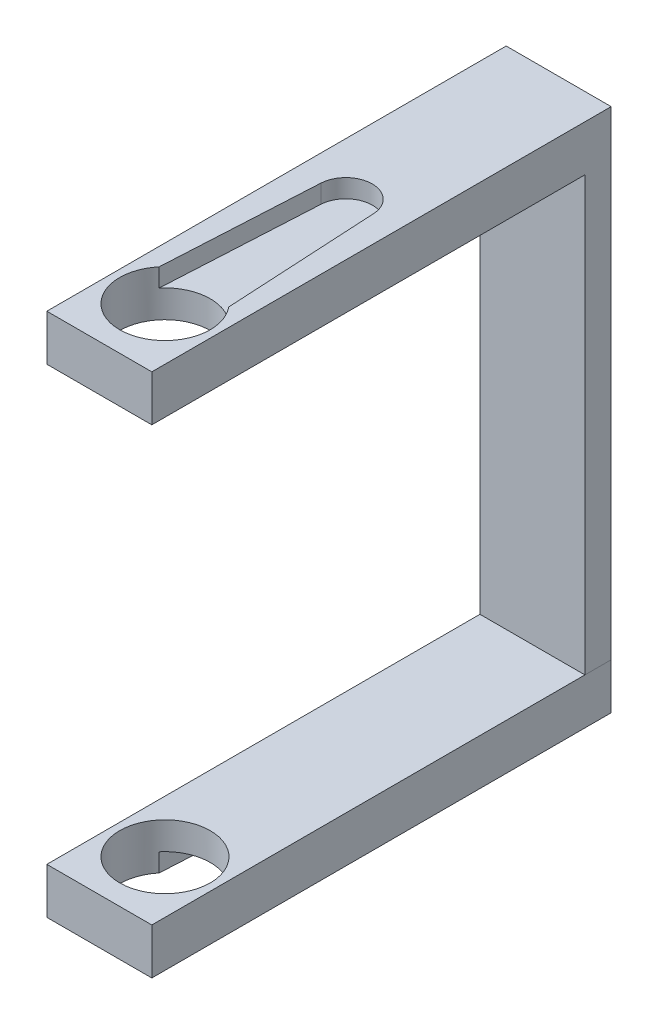
ISO-10303-21;
HEADER;
FILE_DESCRIPTION(('STEP AP214'),'2;1');
FILE_NAME('part.step','',(''),(''),'','','');
FILE_SCHEMA(('AUTOMOTIVE_DESIGN { 1 0 10303 214 1 1 1 1 }'));
ENDSEC;
DATA;
#1=APPLICATION_CONTEXT('core data for automotive mechanical design processes');
#2=APPLICATION_PROTOCOL_DEFINITION('international standard','automotive_design',2000,#1);
#3=PRODUCT_CONTEXT('',#1,'mechanical');
#4=PRODUCT('Part','Part','',(#3));
#5=PRODUCT_RELATED_PRODUCT_CATEGORY('part','',(#4));
#6=PRODUCT_DEFINITION_FORMATION('','',#4);
#7=PRODUCT_DEFINITION_CONTEXT('part definition',#1,'design');
#8=PRODUCT_DEFINITION('design','',#6,#7);
#9=PRODUCT_DEFINITION_SHAPE('','',#8);
#10=(LENGTH_UNIT() NAMED_UNIT(*) SI_UNIT(.MILLI.,.METRE.));
#11=(NAMED_UNIT(*) PLANE_ANGLE_UNIT() SI_UNIT($,.RADIAN.));
#12=(NAMED_UNIT(*) SI_UNIT($,.STERADIAN.) SOLID_ANGLE_UNIT());
#13=UNCERTAINTY_MEASURE_WITH_UNIT(LENGTH_MEASURE(1.E-05),#10,'distance_accuracy_value','');
#14=(GEOMETRIC_REPRESENTATION_CONTEXT(3) GLOBAL_UNCERTAINTY_ASSIGNED_CONTEXT((#13)) GLOBAL_UNIT_ASSIGNED_CONTEXT((#10,
#11,#12)) REPRESENTATION_CONTEXT('',''));
#15=CARTESIAN_POINT('',(0.,0.,0.));
#16=DIRECTION('',(0.,0.,1.));
#17=DIRECTION('',(1.,0.,0.));
#18=AXIS2_PLACEMENT_3D('',#15,#16,#17);
#19=CARTESIAN_POINT('',(-8.68154539456755,-31.6135069515733,35.));
#20=DIRECTION('',(0.,1.,0.));
#21=DIRECTION('',(0.,0.,1.));
#22=AXIS2_PLACEMENT_3D('',#19,#20,#21);
#23=PLANE('',#22);
#24=CARTESIAN_POINT('',(-4.68154539456755,-31.6135069515733,30.));
#25=DIRECTION('',(0.,1.,0.));
#26=DIRECTION('',(0.,0.,1.));
#27=AXIS2_PLACEMENT_3D('',#24,#25,#26);
#28=CIRCLE('',#27,3.45000000000001);
#29=CARTESIAN_POINT('',(-4.68154539456755,-31.6135069515733,33.45));
#30=VERTEX_POINT('',#29);
#31=EDGE_CURVE('E136',#30,#30,#28,.F.);
#32=ORIENTED_EDGE('',*,*,#31,.T.);
#33=EDGE_LOOP('',(#32));
#34=FACE_BOUND('',#33,.T.);
#35=DIRECTION('',(1.,0.,0.));
#36=VECTOR('',#35,1.);
#37=CARTESIAN_POINT('',(-8.68154539456755,-31.6135069515733,0.));
#38=LINE('',#37,#36);
#39=CARTESIAN_POINT('',(-8.68154539456755,-31.6135069515733,0.));
#40=VERTEX_POINT('',#39);
#41=CARTESIAN_POINT('',(-0.681545394567548,-31.6135069515733,0.));
#42=VERTEX_POINT('',#41);
#43=EDGE_CURVE('E12',#40,#42,#38,.T.);
#44=ORIENTED_EDGE('',*,*,#43,.F.);
#45=DIRECTION('',(0.,0.,-1.));
#46=VECTOR('',#45,1.);
#47=CARTESIAN_POINT('',(-8.68154539456755,-31.6135069515733,35.));
#48=LINE('',#47,#46);
#49=CARTESIAN_POINT('',(-8.68154539456755,-31.6135069515733,35.));
#50=VERTEX_POINT('',#49);
#51=EDGE_CURVE('E104',#50,#40,#48,.T.);
#52=ORIENTED_EDGE('',*,*,#51,.F.);
#53=DIRECTION('',(1.,0.,0.));
#54=VECTOR('',#53,1.);
#55=CARTESIAN_POINT('',(-8.68154539456755,-31.6135069515733,35.));
#56=LINE('',#55,#54);
#57=CARTESIAN_POINT('',(-0.681545394567548,-31.6135069515733,35.));
#58=VERTEX_POINT('',#57);
#59=EDGE_CURVE('E54',#50,#58,#56,.T.);
#60=ORIENTED_EDGE('',*,*,#59,.T.);
#61=DIRECTION('',(0.,0.,-1.));
#62=VECTOR('',#61,1.);
#63=CARTESIAN_POINT('',(-0.681545394567548,-31.6135069515733,35.));
#64=LINE('',#63,#62);
#65=EDGE_CURVE('E76',#58,#42,#64,.T.);
#66=ORIENTED_EDGE('',*,*,#65,.T.);
#67=EDGE_LOOP('',(#44,#52,#60,#66));
#68=FACE_BOUND('',#67,.T.);
#69=ADVANCED_FACE('F50',(#34,#68),#23,.T.);
#70=CARTESIAN_POINT('',(-8.68154539456755,-35.1135069515733,35.));
#71=DIRECTION('',(-1.,0.,0.));
#72=DIRECTION('',(0.,0.,1.));
#73=AXIS2_PLACEMENT_3D('',#70,#71,#72);
#74=PLANE('',#73);
#75=DIRECTION('',(0.,1.,0.));
#76=VECTOR('',#75,1.);
#77=CARTESIAN_POINT('',(-8.68154539456755,-35.1135069515733,0.));
#78=LINE('',#77,#76);
#79=CARTESIAN_POINT('',(-8.68154539456755,-35.1135069515733,0.));
#80=VERTEX_POINT('',#79);
#81=EDGE_CURVE('E175',#80,#40,#78,.T.);
#82=ORIENTED_EDGE('',*,*,#81,.F.);
#83=DIRECTION('',(0.,0.,-1.));
#84=VECTOR('',#83,1.);
#85=CARTESIAN_POINT('',(-8.68154539456755,-35.1135069515733,35.));
#86=LINE('',#85,#84);
#87=CARTESIAN_POINT('',(-8.68154539456755,-35.1135069515733,35.));
#88=VERTEX_POINT('',#87);
#89=EDGE_CURVE('E172',#88,#80,#86,.T.);
#90=ORIENTED_EDGE('',*,*,#89,.F.);
#91=DIRECTION('',(0.,1.,0.));
#92=VECTOR('',#91,1.);
#93=CARTESIAN_POINT('',(-8.68154539456755,-35.1135069515733,35.));
#94=LINE('',#93,#92);
#95=EDGE_CURVE('E168',#88,#50,#94,.T.);
#96=ORIENTED_EDGE('',*,*,#95,.T.);
#97=ORIENTED_EDGE('',*,*,#51,.T.);
#98=EDGE_LOOP('',(#82,#90,#96,#97));
#99=FACE_BOUND('',#98,.T.);
#100=ADVANCED_FACE('F184',(#99),#74,.T.);
#101=CARTESIAN_POINT('',(-8.68154539456755,-35.1135069515733,35.));
#102=DIRECTION('',(0.,1.,0.));
#103=DIRECTION('',(0.,0.,1.));
#104=AXIS2_PLACEMENT_3D('',#101,#102,#103);
#105=PLANE('',#104);
#106=DIRECTION('',(0.0545609835210703,0.,-0.998510440144325));
#107=VECTOR('',#106,1.);
#108=CARTESIAN_POINT('',(-6.6930415587696,-35.1135069515733,16.1057875191678));
#109=LINE('',#108,#107);
#110=CARTESIAN_POINT('',(-7.33154539456742,-35.1135069515733,27.7909277965624));
#111=VERTEX_POINT('',#110);
#112=CARTESIAN_POINT('',(-6.6930415587696,-35.1135069515733,16.1057875191678));
#113=VERTEX_POINT('',#112);
#114=EDGE_CURVE('E158',#111,#113,#109,.T.);
#115=ORIENTED_EDGE('',*,*,#114,.F.);
#116=CARTESIAN_POINT('',(-4.68154539456755,-35.1135069515733,30.));
#117=DIRECTION('',(0.,-1.,0.));
#118=DIRECTION('',(0.,0.,-1.));
#119=AXIS2_PLACEMENT_3D('',#116,#117,#118);
#120=CIRCLE('',#119,3.45000000000001);
#121=CARTESIAN_POINT('',(-2.03154539456745,-35.1135069515733,27.7909277965627));
#122=VERTEX_POINT('',#121);
#123=EDGE_CURVE('E67',#122,#111,#120,.T.);
#124=ORIENTED_EDGE('',*,*,#123,.F.);
#125=DIRECTION('',(0.0545609835210535,0.,0.998510440144326));
#126=VECTOR('',#125,1.);
#127=CARTESIAN_POINT('',(-2.03154539456745,-35.1135069515733,27.7909277965627));
#128=LINE('',#127,#126);
#129=CARTESIAN_POINT('',(-2.67004923036508,-35.1135069515733,16.1057875191678));
#130=VERTEX_POINT('',#129);
#131=EDGE_CURVE('E143',#130,#122,#128,.T.);
#132=ORIENTED_EDGE('',*,*,#131,.F.);
#133=CARTESIAN_POINT('',(-4.68154539456734,-35.1135069515733,16.2157004501251));
#134=DIRECTION('',(0.,-1.,0.));
#135=DIRECTION('',(0.,0.,-1.));
#136=AXIS2_PLACEMENT_3D('',#133,#134,#135);
#137=CIRCLE('',#136,2.01449687788093);
#138=EDGE_CURVE('E161',#113,#130,#137,.T.);
#139=ORIENTED_EDGE('',*,*,#138,.F.);
#140=EDGE_LOOP('',(#115,#124,#132,#139));
#141=FACE_BOUND('',#140,.T.);
#142=DIRECTION('',(1.,0.,0.));
#143=VECTOR('',#142,1.);
#144=CARTESIAN_POINT('',(-8.68154539456755,-35.1135069515733,0.));
#145=LINE('',#144,#143);
#146=CARTESIAN_POINT('',(-0.681545394567551,-35.1135069515733,0.));
#147=VERTEX_POINT('',#146);
#148=EDGE_CURVE('E178',#80,#147,#145,.T.);
#149=ORIENTED_EDGE('',*,*,#148,.T.);
#150=DIRECTION('',(0.,0.,-1.));
#151=VECTOR('',#150,1.);
#152=CARTESIAN_POINT('',(-0.681545394567551,-35.1135069515733,35.));
#153=LINE('',#152,#151);
#154=CARTESIAN_POINT('',(-0.681545394567551,-35.1135069515733,35.));
#155=VERTEX_POINT('',#154);
#156=EDGE_CURVE('E169',#155,#147,#153,.T.);
#157=ORIENTED_EDGE('',*,*,#156,.F.);
#158=DIRECTION('',(1.,0.,0.));
#159=VECTOR('',#158,1.);
#160=CARTESIAN_POINT('',(-8.68154539456755,-35.1135069515733,35.));
#161=LINE('',#160,#159);
#162=EDGE_CURVE('E182',#88,#155,#161,.T.);
#163=ORIENTED_EDGE('',*,*,#162,.F.);
#164=ORIENTED_EDGE('',*,*,#89,.T.);
#165=EDGE_LOOP('',(#149,#157,#163,#164));
#166=FACE_BOUND('',#165,.T.);
#167=ADVANCED_FACE('F189',(#141,#166),#105,.F.);
#168=CARTESIAN_POINT('',(-0.681545394567551,-35.1135069515733,35.));
#169=DIRECTION('',(-1.,0.,0.));
#170=DIRECTION('',(0.,-1.,0.));
#171=AXIS2_PLACEMENT_3D('',#168,#169,#170);
#172=PLANE('',#171);
#173=DIRECTION('',(0.,1.,0.));
#174=VECTOR('',#173,1.);
#175=CARTESIAN_POINT('',(-0.681545394567551,-35.1135069515733,0.));
#176=LINE('',#175,#174);
#177=EDGE_CURVE('E59',#147,#42,#176,.T.);
#178=ORIENTED_EDGE('',*,*,#177,.T.);
#179=ORIENTED_EDGE('',*,*,#65,.F.);
#180=DIRECTION('',(0.,1.,0.));
#181=VECTOR('',#180,1.);
#182=CARTESIAN_POINT('',(-0.681545394567551,-35.1135069515733,35.));
#183=LINE('',#182,#181);
#184=EDGE_CURVE('E98',#155,#58,#183,.T.);
#185=ORIENTED_EDGE('',*,*,#184,.F.);
#186=ORIENTED_EDGE('',*,*,#156,.T.);
#187=EDGE_LOOP('',(#178,#179,#185,#186));
#188=FACE_BOUND('',#187,.T.);
#189=ADVANCED_FACE('F192',(#188),#172,.F.);
#190=CARTESIAN_POINT('',(0.,0.,35.));
#191=DIRECTION('',(0.,0.,1.));
#192=DIRECTION('',(1.,0.,0.));
#193=AXIS2_PLACEMENT_3D('',#190,#191,#192);
#194=PLANE('',#193);
#195=ORIENTED_EDGE('',*,*,#59,.F.);
#196=ORIENTED_EDGE('',*,*,#95,.F.);
#197=ORIENTED_EDGE('',*,*,#162,.T.);
#198=ORIENTED_EDGE('',*,*,#184,.T.);
#199=EDGE_LOOP('',(#195,#196,#197,#198));
#200=FACE_BOUND('',#199,.T.);
#201=ADVANCED_FACE('F52',(#200),#194,.T.);
#202=CARTESIAN_POINT('',(0.,0.,0.));
#203=DIRECTION('',(0.,0.,1.));
#204=DIRECTION('',(1.,0.,0.));
#205=AXIS2_PLACEMENT_3D('',#202,#203,#204);
#206=PLANE('',#205);
#207=ORIENTED_EDGE('',*,*,#43,.T.);
#208=ORIENTED_EDGE('',*,*,#177,.F.);
#209=ORIENTED_EDGE('',*,*,#148,.F.);
#210=ORIENTED_EDGE('',*,*,#81,.T.);
#211=EDGE_LOOP('',(#207,#208,#209,#210));
#212=FACE_BOUND('',#211,.T.);
#213=ADVANCED_FACE('F194',(#212),#206,.F.);
#214=CARTESIAN_POINT('',(-4.68154539456755,-33.7135069515733,30.));
#215=DIRECTION('',(0.,-1.,0.));
#216=DIRECTION('',(0.,0.,-1.));
#217=AXIS2_PLACEMENT_3D('',#214,#215,#216);
#218=CYLINDRICAL_SURFACE('',#217,3.45000000000001);
#219=ORIENTED_EDGE('',*,*,#123,.T.);
#220=DIRECTION('',(0.,-1.,0.));
#221=VECTOR('',#220,1.);
#222=CARTESIAN_POINT('',(-7.33154539456742,-33.7135069515733,27.7909277965624));
#223=LINE('',#222,#221);
#224=CARTESIAN_POINT('',(-7.33154539456742,-33.7135069515733,27.7909277965624));
#225=VERTEX_POINT('',#224);
#226=EDGE_CURVE('E131',#225,#111,#223,.T.);
#227=ORIENTED_EDGE('',*,*,#226,.F.);
#228=CARTESIAN_POINT('',(-4.68154539456755,-33.7135069515733,30.));
#229=DIRECTION('',(0.,-1.,0.));
#230=DIRECTION('',(0.,0.,-1.));
#231=AXIS2_PLACEMENT_3D('',#228,#229,#230);
#232=CIRCLE('',#231,3.45000000000001);
#233=CARTESIAN_POINT('',(-2.03154539456745,-33.7135069515733,27.7909277965627));
#234=VERTEX_POINT('',#233);
#235=EDGE_CURVE('E125',#234,#225,#232,.F.);
#236=ORIENTED_EDGE('',*,*,#235,.F.);
#237=DIRECTION('',(0.,-1.,0.));
#238=VECTOR('',#237,1.);
#239=CARTESIAN_POINT('',(-2.03154539456745,-33.7135069515733,27.7909277965627));
#240=LINE('',#239,#238);
#241=EDGE_CURVE('E129',#234,#122,#240,.T.);
#242=ORIENTED_EDGE('',*,*,#241,.T.);
#243=EDGE_LOOP('',(#219,#227,#236,#242));
#244=FACE_BOUND('',#243,.T.);
#245=ORIENTED_EDGE('',*,*,#31,.F.);
#246=EDGE_LOOP('',(#245));
#247=FACE_BOUND('',#246,.T.);
#248=ADVANCED_FACE('F127',(#244,#247),#218,.F.);
#249=CARTESIAN_POINT('',(-2.03154539456745,-33.7135069515733,27.7909277965627));
#250=DIRECTION('',(0.998510440144326,0.,-0.0545609835210535));
#251=DIRECTION('',(-0.0545609835210535,0.,-0.998510440144326));
#252=AXIS2_PLACEMENT_3D('',#249,#250,#251);
#253=PLANE('',#252);
#254=ORIENTED_EDGE('',*,*,#131,.T.);
#255=ORIENTED_EDGE('',*,*,#241,.F.);
#256=DIRECTION('',(0.0545609835210535,0.,0.998510440144326));
#257=VECTOR('',#256,1.);
#258=CARTESIAN_POINT('',(-2.03154539456745,-33.7135069515733,27.7909277965627));
#259=LINE('',#258,#257);
#260=CARTESIAN_POINT('',(-2.67004923036508,-33.7135069515733,16.1057875191678));
#261=VERTEX_POINT('',#260);
#262=EDGE_CURVE('E141',#261,#234,#259,.T.);
#263=ORIENTED_EDGE('',*,*,#262,.F.);
#264=DIRECTION('',(0.,-1.,0.));
#265=VECTOR('',#264,1.);
#266=CARTESIAN_POINT('',(-2.67004923036508,-33.7135069515733,16.1057875191678));
#267=LINE('',#266,#265);
#268=EDGE_CURVE('E144',#261,#130,#267,.T.);
#269=ORIENTED_EDGE('',*,*,#268,.T.);
#270=EDGE_LOOP('',(#254,#255,#263,#269));
#271=FACE_BOUND('',#270,.T.);
#272=ADVANCED_FACE('F140',(#271),#253,.F.);
#273=CARTESIAN_POINT('',(-4.68154539456734,-33.7135069515733,16.2157004501251));
#274=DIRECTION('',(0.,-1.,0.));
#275=DIRECTION('',(0.,0.,-1.));
#276=AXIS2_PLACEMENT_3D('',#273,#274,#275);
#277=CYLINDRICAL_SURFACE('',#276,2.01449687788093);
#278=ORIENTED_EDGE('',*,*,#138,.T.);
#279=ORIENTED_EDGE('',*,*,#268,.F.);
#280=CARTESIAN_POINT('',(-4.68154539456734,-33.7135069515733,16.2157004501251));
#281=DIRECTION('',(0.,-1.,0.));
#282=DIRECTION('',(0.,0.,-1.));
#283=AXIS2_PLACEMENT_3D('',#280,#281,#282);
#284=CIRCLE('',#283,2.01449687788093);
#285=CARTESIAN_POINT('',(-6.6930415587696,-33.7135069515733,16.1057875191678));
#286=VERTEX_POINT('',#285);
#287=EDGE_CURVE('E149',#286,#261,#284,.T.);
#288=ORIENTED_EDGE('',*,*,#287,.F.);
#289=DIRECTION('',(0.,-1.,0.));
#290=VECTOR('',#289,1.);
#291=CARTESIAN_POINT('',(-6.6930415587696,-33.7135069515733,16.1057875191678));
#292=LINE('',#291,#290);
#293=EDGE_CURVE('E151',#286,#113,#292,.T.);
#294=ORIENTED_EDGE('',*,*,#293,.T.);
#295=EDGE_LOOP('',(#278,#279,#288,#294));
#296=FACE_BOUND('',#295,.T.);
#297=ADVANCED_FACE('F226',(#296),#277,.F.);
#298=CARTESIAN_POINT('',(-6.6930415587696,-33.7135069515733,16.1057875191678));
#299=DIRECTION('',(-0.998510440144325,0.,-0.0545609835210703));
#300=DIRECTION('',(-0.0545609835210703,0.,0.998510440144325));
#301=AXIS2_PLACEMENT_3D('',#298,#299,#300);
#302=PLANE('',#301);
#303=ORIENTED_EDGE('',*,*,#114,.T.);
#304=ORIENTED_EDGE('',*,*,#293,.F.);
#305=DIRECTION('',(0.0545609835210703,0.,-0.998510440144325));
#306=VECTOR('',#305,1.);
#307=CARTESIAN_POINT('',(-6.6930415587696,-33.7135069515733,16.1057875191678));
#308=LINE('',#307,#306);
#309=EDGE_CURVE('E153',#225,#286,#308,.T.);
#310=ORIENTED_EDGE('',*,*,#309,.F.);
#311=ORIENTED_EDGE('',*,*,#226,.T.);
#312=EDGE_LOOP('',(#303,#304,#310,#311));
#313=FACE_BOUND('',#312,.T.);
#314=ADVANCED_FACE('F222',(#313),#302,.F.);
#315=CARTESIAN_POINT('',(-4.68154539456755,-33.7135069515733,30.));
#316=DIRECTION('',(0.,-1.,0.));
#317=DIRECTION('',(0.,0.,-1.));
#318=AXIS2_PLACEMENT_3D('',#315,#316,#317);
#319=PLANE('',#318);
#320=ORIENTED_EDGE('',*,*,#262,.T.);
#321=ORIENTED_EDGE('',*,*,#235,.T.);
#322=ORIENTED_EDGE('',*,*,#309,.T.);
#323=ORIENTED_EDGE('',*,*,#287,.T.);
#324=EDGE_LOOP('',(#320,#321,#322,#323));
#325=FACE_BOUND('',#324,.T.);
#326=ADVANCED_FACE('F147',(#325),#319,.T.);
#327=CLOSED_SHELL('',(#69,#100,#167,#189,#201,#213,#248,#272,#297,#314,#326));
#328=MANIFOLD_SOLID_BREP('B2',#327);
#329=CARTESIAN_POINT('',(0.,4.88649304842668,35.));
#330=DIRECTION('',(0.,1.,0.));
#331=DIRECTION('',(-1.,0.,0.));
#332=AXIS2_PLACEMENT_3D('',#329,#330,#331);
#333=PLANE('',#332);
#334=DIRECTION('',(1.,0.,0.));
#335=VECTOR('',#334,1.);
#336=CARTESIAN_POINT('',(0.,4.88649304842668,0.));
#337=LINE('',#336,#335);
#338=CARTESIAN_POINT('',(-8.68154539456756,4.88649304842668,0.));
#339=VERTEX_POINT('',#338);
#340=CARTESIAN_POINT('',(-0.681545394567556,4.88649304842668,0.));
#341=VERTEX_POINT('',#340);
#342=EDGE_CURVE('E428',#339,#341,#337,.T.);
#343=ORIENTED_EDGE('',*,*,#342,.F.);
#344=DIRECTION('',(0.,0.,-1.));
#345=VECTOR('',#344,1.);
#346=CARTESIAN_POINT('',(-8.68154539456756,4.88649304842668,35.));
#347=LINE('',#346,#345);
#348=CARTESIAN_POINT('',(-8.68154539456756,4.88649304842668,35.));
#349=VERTEX_POINT('',#348);
#350=EDGE_CURVE('E436',#349,#339,#347,.T.);
#351=ORIENTED_EDGE('',*,*,#350,.F.);
#352=DIRECTION('',(1.,0.,0.));
#353=VECTOR('',#352,1.);
#354=CARTESIAN_POINT('',(0.,4.88649304842668,35.));
#355=LINE('',#354,#353);
#356=CARTESIAN_POINT('',(-0.681545394567556,4.88649304842668,35.));
#357=VERTEX_POINT('',#356);
#358=EDGE_CURVE('E433',#349,#357,#355,.T.);
#359=ORIENTED_EDGE('',*,*,#358,.T.);
#360=DIRECTION('',(0.,0.,-1.));
#361=VECTOR('',#360,1.);
#362=CARTESIAN_POINT('',(-0.681545394567556,4.88649304842668,35.));
#363=LINE('',#362,#361);
#364=EDGE_CURVE('E443',#357,#341,#363,.T.);
#365=ORIENTED_EDGE('',*,*,#364,.T.);
#366=EDGE_LOOP('',(#343,#351,#359,#365));
#367=FACE_BOUND('',#366,.T.);
#368=CARTESIAN_POINT('',(-4.68154539456767,4.88649304842668,16.215700450125));
#369=DIRECTION('',(0.,1.,0.));
#370=DIRECTION('',(0.,0.,1.));
#371=AXIS2_PLACEMENT_3D('',#368,#369,#370);
#372=CIRCLE('',#371,2.01449687788093);
#373=CARTESIAN_POINT('',(-2.67004923036541,4.88649304842668,16.1057875191677));
#374=VERTEX_POINT('',#373);
#375=CARTESIAN_POINT('',(-6.69304155876993,4.88649304842668,16.1057875191677));
#376=VERTEX_POINT('',#375);
#377=EDGE_CURVE('E491',#374,#376,#372,.T.);
#378=ORIENTED_EDGE('',*,*,#377,.F.);
#379=DIRECTION('',(0.0545609835210622,0.,0.998510440144326));
#380=VECTOR('',#379,1.);
#381=CARTESIAN_POINT('',(-3.5395394186154,4.88649304842668,0.193408845943875));
#382=LINE('',#381,#380);
#383=CARTESIAN_POINT('',(-2.03154539456768,4.88649304842668,27.7909277965624));
#384=VERTEX_POINT('',#383);
#385=EDGE_CURVE('E312',#374,#384,#382,.T.);
#386=ORIENTED_EDGE('',*,*,#385,.T.);
#387=CARTESIAN_POINT('',(-4.68154539456756,4.88649304842668,30.));
#388=DIRECTION('',(0.,1.,0.));
#389=DIRECTION('',(0.,0.,1.));
#390=AXIS2_PLACEMENT_3D('',#387,#388,#389);
#391=CIRCLE('',#390,3.45);
#392=CARTESIAN_POINT('',(-7.33154539456768,4.88649304842668,27.7909277965627));
#393=VERTEX_POINT('',#392);
#394=EDGE_CURVE('E392',#393,#384,#391,.T.);
#395=ORIENTED_EDGE('',*,*,#394,.F.);
#396=DIRECTION('',(0.054560983521062,0.,-0.998510440144326));
#397=VECTOR('',#396,1.);
#398=CARTESIAN_POINT('',(-5.79567837690965,4.88649304842668,-0.316689640591275));
#399=LINE('',#398,#397);
#400=EDGE_CURVE('E497',#393,#376,#399,.T.);
#401=ORIENTED_EDGE('',*,*,#400,.T.);
#402=EDGE_LOOP('',(#378,#386,#395,#401));
#403=FACE_BOUND('',#402,.T.);
#404=ADVANCED_FACE('F297',(#367,#403),#333,.T.);
#405=CARTESIAN_POINT('',(-8.68154539456756,0.,35.));
#406=DIRECTION('',(1.,0.,0.));
#407=DIRECTION('',(0.,1.,0.));
#408=AXIS2_PLACEMENT_3D('',#405,#406,#407);
#409=PLANE('',#408);
#410=DIRECTION('',(0.,-1.,0.));
#411=VECTOR('',#410,1.);
#412=CARTESIAN_POINT('',(-8.68154539456756,0.,0.));
#413=LINE('',#412,#411);
#414=CARTESIAN_POINT('',(-8.68154539456755,-31.6135069515733,0.));
#415=VERTEX_POINT('',#414);
#416=EDGE_CURVE('E423',#339,#415,#413,.T.);
#417=ORIENTED_EDGE('',*,*,#416,.T.);
#418=DIRECTION('',(0.,0.,-1.));
#419=VECTOR('',#418,1.);
#420=CARTESIAN_POINT('',(-8.68154539456755,-31.6135069515733,2.));
#421=LINE('',#420,#419);
#422=CARTESIAN_POINT('',(-8.68154539456755,-31.6135069515733,2.));
#423=VERTEX_POINT('',#422);
#424=EDGE_CURVE('E420',#423,#415,#421,.T.);
#425=ORIENTED_EDGE('',*,*,#424,.F.);
#426=DIRECTION('',(0.,-1.,0.));
#427=VECTOR('',#426,1.);
#428=CARTESIAN_POINT('',(-8.68154539456756,0.,2.));
#429=LINE('',#428,#427);
#430=CARTESIAN_POINT('',(-8.68154539456756,1.38649304842668,2.));
#431=VERTEX_POINT('',#430);
#432=EDGE_CURVE('E401',#431,#423,#429,.T.);
#433=ORIENTED_EDGE('',*,*,#432,.F.);
#434=DIRECTION('',(0.,0.,-1.));
#435=VECTOR('',#434,1.);
#436=CARTESIAN_POINT('',(-8.68154539456756,1.38649304842668,35.));
#437=LINE('',#436,#435);
#438=CARTESIAN_POINT('',(-8.68154539456756,1.38649304842668,35.));
#439=VERTEX_POINT('',#438);
#440=EDGE_CURVE('E48',#439,#431,#437,.T.);
#441=ORIENTED_EDGE('',*,*,#440,.F.);
#442=DIRECTION('',(0.,-1.,0.));
#443=VECTOR('',#442,1.);
#444=CARTESIAN_POINT('',(-8.68154539456756,0.,35.));
#445=LINE('',#444,#443);
#446=EDGE_CURVE('E424',#349,#439,#445,.T.);
#447=ORIENTED_EDGE('',*,*,#446,.F.);
#448=ORIENTED_EDGE('',*,*,#350,.T.);
#449=EDGE_LOOP('',(#417,#425,#433,#441,#447,#448));
#450=FACE_BOUND('',#449,.T.);
#451=ADVANCED_FACE('F299',(#450),#409,.F.);
#452=CARTESIAN_POINT('',(0.,1.38649304842668,35.));
#453=DIRECTION('',(0.,1.,0.));
#454=DIRECTION('',(0.,0.,1.));
#455=AXIS2_PLACEMENT_3D('',#452,#453,#454);
#456=PLANE('',#455);
#457=CARTESIAN_POINT('',(-4.68154539456756,1.38649304842668,30.));
#458=DIRECTION('',(0.,1.,0.));
#459=DIRECTION('',(0.,0.,1.));
#460=AXIS2_PLACEMENT_3D('',#457,#458,#459);
#461=CIRCLE('',#460,3.45);
#462=CARTESIAN_POINT('',(-4.68154539456756,1.38649304842668,33.45));
#463=VERTEX_POINT('',#462);
#464=EDGE_CURVE('E385',#463,#463,#461,.F.);
#465=ORIENTED_EDGE('',*,*,#464,.F.);
#466=EDGE_LOOP('',(#465));
#467=FACE_BOUND('',#466,.T.);
#468=ORIENTED_EDGE('',*,*,#440,.T.);
#469=DIRECTION('',(1.,0.,0.));
#470=VECTOR('',#469,1.);
#471=CARTESIAN_POINT('',(0.,1.38649304842668,2.));
#472=LINE('',#471,#470);
#473=CARTESIAN_POINT('',(-0.681545394567556,1.38649304842668,2.));
#474=VERTEX_POINT('',#473);
#475=EDGE_CURVE('E415',#431,#474,#472,.T.);
#476=ORIENTED_EDGE('',*,*,#475,.T.);
#477=DIRECTION('',(0.,0.,-1.));
#478=VECTOR('',#477,1.);
#479=CARTESIAN_POINT('',(-0.681545394567556,1.38649304842668,35.));
#480=LINE('',#479,#478);
#481=CARTESIAN_POINT('',(-0.681545394567556,1.38649304842668,35.));
#482=VERTEX_POINT('',#481);
#483=EDGE_CURVE('E305',#482,#474,#480,.T.);
#484=ORIENTED_EDGE('',*,*,#483,.F.);
#485=DIRECTION('',(1.,0.,0.));
#486=VECTOR('',#485,1.);
#487=CARTESIAN_POINT('',(0.,1.38649304842668,35.));
#488=LINE('',#487,#486);
#489=EDGE_CURVE('E427',#439,#482,#488,.T.);
#490=ORIENTED_EDGE('',*,*,#489,.F.);
#491=EDGE_LOOP('',(#468,#476,#484,#490));
#492=FACE_BOUND('',#491,.T.);
#493=ADVANCED_FACE('F451',(#467,#492),#456,.F.);
#494=CARTESIAN_POINT('',(-0.681545394567555,0.,35.));
#495=DIRECTION('',(1.,0.,0.));
#496=DIRECTION('',(0.,1.,0.));
#497=AXIS2_PLACEMENT_3D('',#494,#495,#496);
#498=PLANE('',#497);
#499=DIRECTION('',(0.,-1.,0.));
#500=VECTOR('',#499,1.);
#501=CARTESIAN_POINT('',(-0.681545394567555,0.,0.));
#502=LINE('',#501,#500);
#503=CARTESIAN_POINT('',(-0.681545394567551,-31.6135069515733,0.));
#504=VERTEX_POINT('',#503);
#505=EDGE_CURVE('E438',#341,#504,#502,.T.);
#506=ORIENTED_EDGE('',*,*,#505,.F.);
#507=ORIENTED_EDGE('',*,*,#364,.F.);
#508=DIRECTION('',(0.,-1.,0.));
#509=VECTOR('',#508,1.);
#510=CARTESIAN_POINT('',(-0.681545394567555,0.,35.));
#511=LINE('',#510,#509);
#512=EDGE_CURVE('E430',#357,#482,#511,.T.);
#513=ORIENTED_EDGE('',*,*,#512,.T.);
#514=ORIENTED_EDGE('',*,*,#483,.T.);
#515=DIRECTION('',(0.,-1.,0.));
#516=VECTOR('',#515,1.);
#517=CARTESIAN_POINT('',(-0.681545394567555,0.,2.));
#518=LINE('',#517,#516);
#519=CARTESIAN_POINT('',(-0.681545394567551,-31.6135069515733,2.));
#520=VERTEX_POINT('',#519);
#521=EDGE_CURVE('E320',#474,#520,#518,.T.);
#522=ORIENTED_EDGE('',*,*,#521,.T.);
#523=DIRECTION('',(0.,0.,-1.));
#524=VECTOR('',#523,1.);
#525=CARTESIAN_POINT('',(-0.681545394567551,-31.6135069515733,2.));
#526=LINE('',#525,#524);
#527=EDGE_CURVE('E416',#520,#504,#526,.T.);
#528=ORIENTED_EDGE('',*,*,#527,.T.);
#529=EDGE_LOOP('',(#506,#507,#513,#514,#522,#528));
#530=FACE_BOUND('',#529,.T.);
#531=ADVANCED_FACE('F448',(#530),#498,.T.);
#532=CARTESIAN_POINT('',(0.,0.,35.));
#533=DIRECTION('',(0.,0.,1.));
#534=DIRECTION('',(1.,0.,0.));
#535=AXIS2_PLACEMENT_3D('',#532,#533,#534);
#536=PLANE('',#535);
#537=ORIENTED_EDGE('',*,*,#446,.T.);
#538=ORIENTED_EDGE('',*,*,#489,.T.);
#539=ORIENTED_EDGE('',*,*,#512,.F.);
#540=ORIENTED_EDGE('',*,*,#358,.F.);
#541=EDGE_LOOP('',(#537,#538,#539,#540));
#542=FACE_BOUND('',#541,.T.);
#543=ADVANCED_FACE('F469',(#542),#536,.T.);
#544=CARTESIAN_POINT('',(0.,0.,0.));
#545=DIRECTION('',(0.,0.,1.));
#546=DIRECTION('',(1.,0.,0.));
#547=AXIS2_PLACEMENT_3D('',#544,#545,#546);
#548=PLANE('',#547);
#549=ORIENTED_EDGE('',*,*,#416,.F.);
#550=ORIENTED_EDGE('',*,*,#342,.T.);
#551=ORIENTED_EDGE('',*,*,#505,.T.);
#552=DIRECTION('',(1.,0.,0.));
#553=VECTOR('',#552,1.);
#554=CARTESIAN_POINT('',(0.,-31.6135069515733,0.));
#555=LINE('',#554,#553);
#556=EDGE_CURVE('E397',#415,#504,#555,.T.);
#557=ORIENTED_EDGE('',*,*,#556,.F.);
#558=EDGE_LOOP('',(#549,#550,#551,#557));
#559=FACE_BOUND('',#558,.T.);
#560=ADVANCED_FACE('F463',(#559),#548,.F.);
#561=CARTESIAN_POINT('',(0.,-31.6135069515733,2.));
#562=DIRECTION('',(0.,1.,0.));
#563=DIRECTION('',(0.,0.,1.));
#564=AXIS2_PLACEMENT_3D('',#561,#562,#563);
#565=PLANE('',#564);
#566=ORIENTED_EDGE('',*,*,#556,.T.);
#567=ORIENTED_EDGE('',*,*,#527,.F.);
#568=DIRECTION('',(1.,0.,0.));
#569=VECTOR('',#568,1.);
#570=CARTESIAN_POINT('',(0.,-31.6135069515733,2.));
#571=LINE('',#570,#569);
#572=EDGE_CURVE('E412',#423,#520,#571,.T.);
#573=ORIENTED_EDGE('',*,*,#572,.F.);
#574=ORIENTED_EDGE('',*,*,#424,.T.);
#575=EDGE_LOOP('',(#566,#567,#573,#574));
#576=FACE_BOUND('',#575,.T.);
#577=ADVANCED_FACE('F460',(#576),#565,.F.);
#578=CARTESIAN_POINT('',(0.,0.,2.));
#579=DIRECTION('',(0.,0.,1.));
#580=DIRECTION('',(1.,0.,0.));
#581=AXIS2_PLACEMENT_3D('',#578,#579,#580);
#582=PLANE('',#581);
#583=ORIENTED_EDGE('',*,*,#432,.T.);
#584=ORIENTED_EDGE('',*,*,#572,.T.);
#585=ORIENTED_EDGE('',*,*,#521,.F.);
#586=ORIENTED_EDGE('',*,*,#475,.F.);
#587=EDGE_LOOP('',(#583,#584,#585,#586));
#588=FACE_BOUND('',#587,.T.);
#589=ADVANCED_FACE('F453',(#588),#582,.T.);
#590=CARTESIAN_POINT('',(-3.5395394186154,3.48649304842668,0.193408845943875));
#591=DIRECTION('',(-0.998510440144325,0.,0.0545609835210622));
#592=DIRECTION('',(0.0545609835210622,0.,0.998510440144326));
#593=AXIS2_PLACEMENT_3D('',#590,#591,#592);
#594=PLANE('',#593);
#595=ORIENTED_EDGE('',*,*,#385,.F.);
#596=DIRECTION('',(0.,1.,0.));
#597=VECTOR('',#596,1.);
#598=CARTESIAN_POINT('',(-2.67004923036541,3.48649304842668,16.1057875191677));
#599=LINE('',#598,#597);
#600=CARTESIAN_POINT('',(-2.67004923036541,3.48649304842668,16.1057875191677));
#601=VERTEX_POINT('',#600);
#602=EDGE_CURVE('E390',#601,#374,#599,.T.);
#603=ORIENTED_EDGE('',*,*,#602,.F.);
#604=DIRECTION('',(0.0545609835210622,0.,0.998510440144326));
#605=VECTOR('',#604,1.);
#606=CARTESIAN_POINT('',(-3.5395394186154,3.48649304842668,0.193408845943875));
#607=LINE('',#606,#605);
#608=CARTESIAN_POINT('',(-2.03154539456768,3.48649304842668,27.7909277965624));
#609=VERTEX_POINT('',#608);
#610=EDGE_CURVE('E379',#601,#609,#607,.T.);
#611=ORIENTED_EDGE('',*,*,#610,.T.);
#612=DIRECTION('',(0.,1.,0.));
#613=VECTOR('',#612,1.);
#614=CARTESIAN_POINT('',(-2.03154539456768,3.48649304842668,27.7909277965624));
#615=LINE('',#614,#613);
#616=EDGE_CURVE('E388',#609,#384,#615,.T.);
#617=ORIENTED_EDGE('',*,*,#616,.T.);
#618=EDGE_LOOP('',(#595,#603,#611,#617));
#619=FACE_BOUND('',#618,.T.);
#620=ADVANCED_FACE('F387',(#619),#594,.T.);
#621=CARTESIAN_POINT('',(-4.68154539456756,3.48649304842668,30.));
#622=DIRECTION('',(0.,1.,0.));
#623=DIRECTION('',(0.,0.,1.));
#624=AXIS2_PLACEMENT_3D('',#621,#622,#623);
#625=CYLINDRICAL_SURFACE('',#624,3.45);
#626=ORIENTED_EDGE('',*,*,#394,.T.);
#627=ORIENTED_EDGE('',*,*,#616,.F.);
#628=CARTESIAN_POINT('',(-4.68154539456756,3.48649304842668,30.));
#629=DIRECTION('',(0.,1.,0.));
#630=DIRECTION('',(0.,0.,1.));
#631=AXIS2_PLACEMENT_3D('',#628,#629,#630);
#632=CIRCLE('',#631,3.45);
#633=CARTESIAN_POINT('',(-7.33154539456768,3.48649304842668,27.7909277965627));
#634=VERTEX_POINT('',#633);
#635=EDGE_CURVE('E375',#609,#634,#632,.T.);
#636=ORIENTED_EDGE('',*,*,#635,.T.);
#637=DIRECTION('',(0.,1.,0.));
#638=VECTOR('',#637,1.);
#639=CARTESIAN_POINT('',(-7.33154539456768,3.48649304842668,27.7909277965627));
#640=LINE('',#639,#638);
#641=EDGE_CURVE('E398',#634,#393,#640,.T.);
#642=ORIENTED_EDGE('',*,*,#641,.T.);
#643=EDGE_LOOP('',(#626,#627,#636,#642));
#644=FACE_BOUND('',#643,.T.);
#645=ORIENTED_EDGE('',*,*,#464,.T.);
#646=EDGE_LOOP('',(#645));
#647=FACE_BOUND('',#646,.T.);
#648=ADVANCED_FACE('F394',(#644,#647),#625,.F.);
#649=CARTESIAN_POINT('',(-5.79567837690965,3.48649304842668,-0.316689640591275));
#650=DIRECTION('',(0.998510440144325,0.,0.054560983521062));
#651=DIRECTION('',(0.054560983521062,0.,-0.998510440144326));
#652=AXIS2_PLACEMENT_3D('',#649,#650,#651);
#653=PLANE('',#652);
#654=ORIENTED_EDGE('',*,*,#400,.F.);
#655=ORIENTED_EDGE('',*,*,#641,.F.);
#656=DIRECTION('',(0.054560983521062,0.,-0.998510440144326));
#657=VECTOR('',#656,1.);
#658=CARTESIAN_POINT('',(-5.79567837690965,3.48649304842668,-0.316689640591275));
#659=LINE('',#658,#657);
#660=CARTESIAN_POINT('',(-6.69304155876993,3.48649304842668,16.1057875191677));
#661=VERTEX_POINT('',#660);
#662=EDGE_CURVE('E381',#634,#661,#659,.T.);
#663=ORIENTED_EDGE('',*,*,#662,.T.);
#664=DIRECTION('',(0.,1.,0.));
#665=VECTOR('',#664,1.);
#666=CARTESIAN_POINT('',(-6.69304155876993,3.48649304842668,16.1057875191677));
#667=LINE('',#666,#665);
#668=EDGE_CURVE('E403',#661,#376,#667,.T.);
#669=ORIENTED_EDGE('',*,*,#668,.T.);
#670=EDGE_LOOP('',(#654,#655,#663,#669));
#671=FACE_BOUND('',#670,.T.);
#672=ADVANCED_FACE('F502',(#671),#653,.T.);
#673=CARTESIAN_POINT('',(-4.68154539456767,3.48649304842668,16.215700450125));
#674=DIRECTION('',(0.,1.,0.));
#675=DIRECTION('',(0.,0.,1.));
#676=AXIS2_PLACEMENT_3D('',#673,#674,#675);
#677=CYLINDRICAL_SURFACE('',#676,2.01449687788093);
#678=ORIENTED_EDGE('',*,*,#377,.T.);
#679=ORIENTED_EDGE('',*,*,#668,.F.);
#680=CARTESIAN_POINT('',(-4.68154539456767,3.48649304842668,16.215700450125));
#681=DIRECTION('',(0.,1.,0.));
#682=DIRECTION('',(0.,0.,1.));
#683=AXIS2_PLACEMENT_3D('',#680,#681,#682);
#684=CIRCLE('',#683,2.01449687788093);
#685=EDGE_CURVE('E391',#601,#661,#684,.T.);
#686=ORIENTED_EDGE('',*,*,#685,.F.);
#687=ORIENTED_EDGE('',*,*,#602,.T.);
#688=EDGE_LOOP('',(#678,#679,#686,#687));
#689=FACE_BOUND('',#688,.T.);
#690=ADVANCED_FACE('F505',(#689),#677,.F.);
#691=CARTESIAN_POINT('',(0.,3.48649304842668,0.));
#692=DIRECTION('',(0.,1.,0.));
#693=DIRECTION('',(0.,0.,1.));
#694=AXIS2_PLACEMENT_3D('',#691,#692,#693);
#695=PLANE('',#694);
#696=ORIENTED_EDGE('',*,*,#635,.F.);
#697=ORIENTED_EDGE('',*,*,#610,.F.);
#698=ORIENTED_EDGE('',*,*,#685,.T.);
#699=ORIENTED_EDGE('',*,*,#662,.F.);
#700=EDGE_LOOP('',(#696,#697,#698,#699));
#701=FACE_BOUND('',#700,.T.);
#702=ADVANCED_FACE('F377',(#701),#695,.T.);
#703=CLOSED_SHELL('',(#404,#451,#493,#531,#543,#560,#577,#589,#620,#648,#672,#690,#702));
#704=MANIFOLD_SOLID_BREP('B6',#703);
#705=ADVANCED_BREP_SHAPE_REPRESENTATION('',(#18,#328,#704),#14);
#706=SHAPE_DEFINITION_REPRESENTATION(#9,#705);
ENDSEC;
END-ISO-10303-21;
